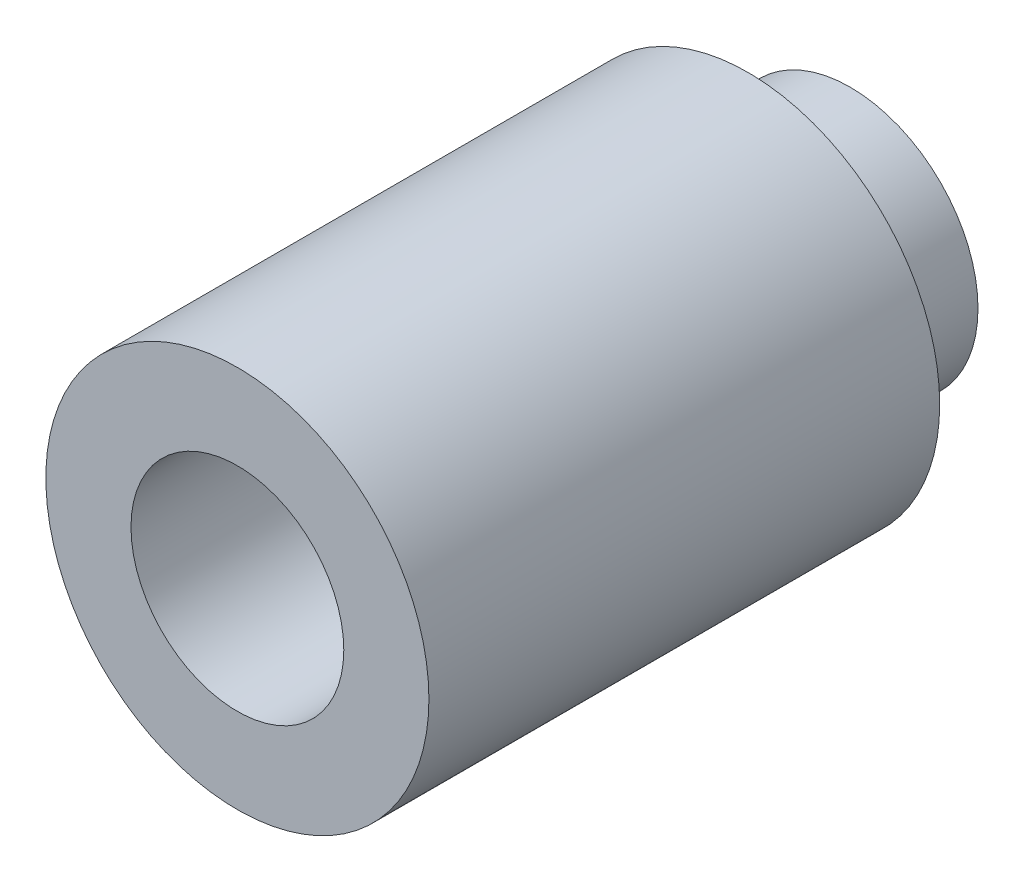
ISO-10303-21;
HEADER;
FILE_DESCRIPTION(('STEP AP214'),'2;1');
FILE_NAME('part.step','',(''),(''),'','','');
FILE_SCHEMA(('AUTOMOTIVE_DESIGN { 1 0 10303 214 1 1 1 1 }'));
ENDSEC;
DATA;
#1=APPLICATION_CONTEXT('core data for automotive mechanical design processes');
#2=APPLICATION_PROTOCOL_DEFINITION('international standard','automotive_design',2000,#1);
#3=PRODUCT_CONTEXT('',#1,'mechanical');
#4=PRODUCT('Part','Part','',(#3));
#5=PRODUCT_RELATED_PRODUCT_CATEGORY('part','',(#4));
#6=PRODUCT_DEFINITION_FORMATION('','',#4);
#7=PRODUCT_DEFINITION_CONTEXT('part definition',#1,'design');
#8=PRODUCT_DEFINITION('design','',#6,#7);
#9=PRODUCT_DEFINITION_SHAPE('','',#8);
#10=(LENGTH_UNIT() NAMED_UNIT(*) SI_UNIT(.MILLI.,.METRE.));
#11=(NAMED_UNIT(*) PLANE_ANGLE_UNIT() SI_UNIT($,.RADIAN.));
#12=(NAMED_UNIT(*) SI_UNIT($,.STERADIAN.) SOLID_ANGLE_UNIT());
#13=UNCERTAINTY_MEASURE_WITH_UNIT(LENGTH_MEASURE(1.E-05),#10,'distance_accuracy_value','');
#14=(GEOMETRIC_REPRESENTATION_CONTEXT(3) GLOBAL_UNCERTAINTY_ASSIGNED_CONTEXT((#13)) GLOBAL_UNIT_ASSIGNED_CONTEXT((#10,
#11,#12)) REPRESENTATION_CONTEXT('',''));
#15=CARTESIAN_POINT('',(0.,0.,0.));
#16=DIRECTION('',(0.,0.,1.));
#17=DIRECTION('',(1.,0.,0.));
#18=AXIS2_PLACEMENT_3D('',#15,#16,#17);
#19=CARTESIAN_POINT('',(0.,0.,0.));
#20=DIRECTION('',(0.,0.,1.));
#21=DIRECTION('',(1.,0.,0.));
#22=AXIS2_PLACEMENT_3D('',#19,#20,#21);
#23=PLANE('',#22);
#24=CARTESIAN_POINT('',(0.,0.,0.));
#25=DIRECTION('',(0.,0.,1.));
#26=DIRECTION('',(1.,0.,0.));
#27=AXIS2_PLACEMENT_3D('',#24,#25,#26);
#28=CIRCLE('',#27,2.25);
#29=CARTESIAN_POINT('',(2.25,0.,0.));
#30=VERTEX_POINT('',#29);
#31=EDGE_CURVE('E48',#30,#30,#28,.T.);
#32=ORIENTED_EDGE('',*,*,#31,.F.);
#33=EDGE_LOOP('',(#32));
#34=FACE_BOUND('',#33,.T.);
#35=CARTESIAN_POINT('',(0.,0.,0.));
#36=DIRECTION('',(0.,0.,1.));
#37=DIRECTION('',(1.,0.,0.));
#38=AXIS2_PLACEMENT_3D('',#35,#36,#37);
#39=CIRCLE('',#38,1.5);
#40=CARTESIAN_POINT('',(1.5,0.,0.));
#41=VERTEX_POINT('',#40);
#42=EDGE_CURVE('E10',#41,#41,#39,.F.);
#43=ORIENTED_EDGE('',*,*,#42,.F.);
#44=EDGE_LOOP('',(#43));
#45=FACE_BOUND('',#44,.T.);
#46=ADVANCED_FACE('F37',(#34,#45),#23,.F.);
#47=CARTESIAN_POINT('',(0.,0.,6.));
#48=DIRECTION('',(0.,0.,1.));
#49=DIRECTION('',(1.,0.,0.));
#50=AXIS2_PLACEMENT_3D('',#47,#48,#49);
#51=PLANE('',#50);
#52=CARTESIAN_POINT('',(0.,0.,6.));
#53=DIRECTION('',(0.,0.,1.));
#54=DIRECTION('',(1.,0.,0.));
#55=AXIS2_PLACEMENT_3D('',#52,#53,#54);
#56=CIRCLE('',#55,2.25);
#57=CARTESIAN_POINT('',(2.25,0.,6.));
#58=VERTEX_POINT('',#57);
#59=EDGE_CURVE('E44',#58,#58,#56,.T.);
#60=ORIENTED_EDGE('',*,*,#59,.T.);
#61=EDGE_LOOP('',(#60));
#62=FACE_BOUND('',#61,.T.);
#63=CARTESIAN_POINT('',(0.,0.,6.));
#64=DIRECTION('',(0.,0.,1.));
#65=DIRECTION('',(1.,0.,0.));
#66=AXIS2_PLACEMENT_3D('',#63,#64,#65);
#67=CIRCLE('',#66,1.25);
#68=CARTESIAN_POINT('',(1.25,0.,6.));
#69=VERTEX_POINT('',#68);
#70=EDGE_CURVE('E53',#69,#69,#67,.T.);
#71=ORIENTED_EDGE('',*,*,#70,.F.);
#72=EDGE_LOOP('',(#71));
#73=FACE_BOUND('',#72,.T.);
#74=ADVANCED_FACE('F80',(#62,#73),#51,.T.);
#75=CARTESIAN_POINT('',(0.,0.,6.));
#76=DIRECTION('',(0.,0.,-1.));
#77=DIRECTION('',(-1.,0.,0.));
#78=AXIS2_PLACEMENT_3D('',#75,#76,#77);
#79=CYLINDRICAL_SURFACE('',#78,2.25);
#80=ORIENTED_EDGE('',*,*,#59,.F.);
#81=EDGE_LOOP('',(#80));
#82=FACE_BOUND('',#81,.T.);
#83=ORIENTED_EDGE('',*,*,#31,.T.);
#84=EDGE_LOOP('',(#83));
#85=FACE_BOUND('',#84,.T.);
#86=ADVANCED_FACE('F39',(#82,#85),#79,.T.);
#87=CARTESIAN_POINT('',(0.,0.,6.));
#88=DIRECTION('',(0.,0.,-1.));
#89=DIRECTION('',(-1.,0.,0.));
#90=AXIS2_PLACEMENT_3D('',#87,#88,#89);
#91=CYLINDRICAL_SURFACE('',#90,1.25);
#92=ORIENTED_EDGE('',*,*,#70,.T.);
#93=EDGE_LOOP('',(#92));
#94=FACE_BOUND('',#93,.T.);
#95=CARTESIAN_POINT('',(0.,0.,-1.2));
#96=DIRECTION('',(0.,0.,-1.));
#97=DIRECTION('',(-1.,0.,0.));
#98=AXIS2_PLACEMENT_3D('',#95,#96,#97);
#99=CIRCLE('',#98,1.25);
#100=CARTESIAN_POINT('',(-1.25,0.,-1.2));
#101=VERTEX_POINT('',#100);
#102=EDGE_CURVE('E60',#101,#101,#99,.T.);
#103=ORIENTED_EDGE('',*,*,#102,.T.);
#104=EDGE_LOOP('',(#103));
#105=FACE_BOUND('',#104,.T.);
#106=ADVANCED_FACE('F64',(#94,#105),#91,.F.);
#107=CARTESIAN_POINT('',(0.,0.,-1.2));
#108=DIRECTION('',(0.,0.,-1.));
#109=DIRECTION('',(-1.,0.,0.));
#110=AXIS2_PLACEMENT_3D('',#107,#108,#109);
#111=PLANE('',#110);
#112=CARTESIAN_POINT('',(0.,0.,-1.2));
#113=DIRECTION('',(0.,0.,-1.));
#114=DIRECTION('',(-1.,0.,0.));
#115=AXIS2_PLACEMENT_3D('',#112,#113,#114);
#116=CIRCLE('',#115,1.5);
#117=CARTESIAN_POINT('',(-1.5,0.,-1.2));
#118=VERTEX_POINT('',#117);
#119=EDGE_CURVE('E57',#118,#118,#116,.T.);
#120=ORIENTED_EDGE('',*,*,#119,.T.);
#121=EDGE_LOOP('',(#120));
#122=FACE_BOUND('',#121,.T.);
#123=ORIENTED_EDGE('',*,*,#102,.F.);
#124=EDGE_LOOP('',(#123));
#125=FACE_BOUND('',#124,.T.);
#126=ADVANCED_FACE('F66',(#122,#125),#111,.T.);
#127=CARTESIAN_POINT('',(0.,0.,-1.2));
#128=DIRECTION('',(0.,0.,1.));
#129=DIRECTION('',(1.,0.,0.));
#130=AXIS2_PLACEMENT_3D('',#127,#128,#129);
#131=CYLINDRICAL_SURFACE('',#130,1.5);
#132=ORIENTED_EDGE('',*,*,#119,.F.);
#133=EDGE_LOOP('',(#132));
#134=FACE_BOUND('',#133,.T.);
#135=ORIENTED_EDGE('',*,*,#42,.T.);
#136=EDGE_LOOP('',(#135));
#137=FACE_BOUND('',#136,.T.);
#138=ADVANCED_FACE('F68',(#134,#137),#131,.T.);
#139=CLOSED_SHELL('',(#46,#74,#86,#106,#126,#138));
#140=MANIFOLD_SOLID_BREP('B2',#139);
#141=ADVANCED_BREP_SHAPE_REPRESENTATION('',(#18,#140),#14);
#142=SHAPE_DEFINITION_REPRESENTATION(#9,#141);
ENDSEC;
END-ISO-10303-21;
